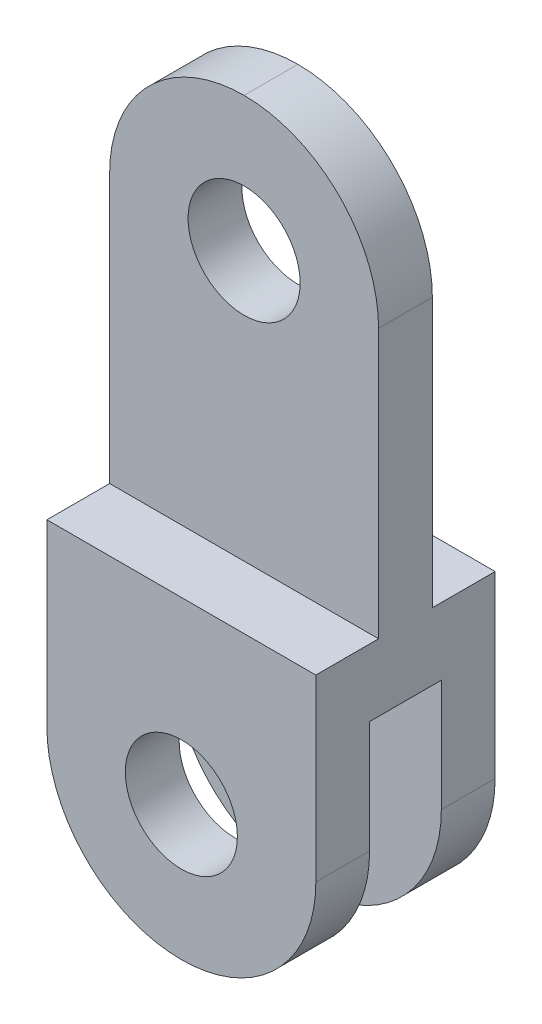
ISO-10303-21;
HEADER;
FILE_DESCRIPTION(('STEP AP214'),'2;1');
FILE_NAME('part.step','',(''),(''),'','','');
FILE_SCHEMA(('AUTOMOTIVE_DESIGN { 1 0 10303 214 1 1 1 1 }'));
ENDSEC;
DATA;
#1=APPLICATION_CONTEXT('core data for automotive mechanical design processes');
#2=APPLICATION_PROTOCOL_DEFINITION('international standard','automotive_design',2000,#1);
#3=PRODUCT_CONTEXT('',#1,'mechanical');
#4=PRODUCT('Part','Part','',(#3));
#5=PRODUCT_RELATED_PRODUCT_CATEGORY('part','',(#4));
#6=PRODUCT_DEFINITION_FORMATION('','',#4);
#7=PRODUCT_DEFINITION_CONTEXT('part definition',#1,'design');
#8=PRODUCT_DEFINITION('design','',#6,#7);
#9=PRODUCT_DEFINITION_SHAPE('','',#8);
#10=(LENGTH_UNIT() NAMED_UNIT(*) SI_UNIT(.MILLI.,.METRE.));
#11=(NAMED_UNIT(*) PLANE_ANGLE_UNIT() SI_UNIT($,.RADIAN.));
#12=(NAMED_UNIT(*) SI_UNIT($,.STERADIAN.) SOLID_ANGLE_UNIT());
#13=UNCERTAINTY_MEASURE_WITH_UNIT(LENGTH_MEASURE(1.E-05),#10,'distance_accuracy_value','');
#14=(GEOMETRIC_REPRESENTATION_CONTEXT(3) GLOBAL_UNCERTAINTY_ASSIGNED_CONTEXT((#13)) GLOBAL_UNIT_ASSIGNED_CONTEXT((#10,
#11,#12)) REPRESENTATION_CONTEXT('',''));
#15=CARTESIAN_POINT('',(0.,0.,0.));
#16=DIRECTION('',(0.,0.,1.));
#17=DIRECTION('',(1.,0.,0.));
#18=AXIS2_PLACEMENT_3D('',#15,#16,#17);
#19=CARTESIAN_POINT('',(30.,-55.,-20.));
#20=DIRECTION('',(0.,0.,1.));
#21=DIRECTION('',(0.,-1.,0.));
#22=AXIS2_PLACEMENT_3D('',#19,#20,#21);
#23=PLANE('',#22);
#24=CARTESIAN_POINT('',(0.,-25.,-20.));
#25=DIRECTION('',(0.,0.,1.));
#26=DIRECTION('',(1.,0.,0.));
#27=AXIS2_PLACEMENT_3D('',#24,#25,#26);
#28=CIRCLE('',#27,12.5);
#29=CARTESIAN_POINT('',(12.5,-25.,-20.));
#30=VERTEX_POINT('',#29);
#31=EDGE_CURVE('E222',#30,#30,#28,.T.);
#32=ORIENTED_EDGE('',*,*,#31,.T.);
#33=EDGE_LOOP('',(#32));
#34=FACE_BOUND('',#33,.T.);
#35=DIRECTION('',(0.,1.,0.));
#36=VECTOR('',#35,1.);
#37=CARTESIAN_POINT('',(30.,-55.,-20.));
#38=LINE('',#37,#36);
#39=CARTESIAN_POINT('',(30.,-25.,-20.));
#40=VERTEX_POINT('',#39);
#41=CARTESIAN_POINT('',(30.,15.,-20.));
#42=VERTEX_POINT('',#41);
#43=EDGE_CURVE('E147',#40,#42,#38,.T.);
#44=ORIENTED_EDGE('',*,*,#43,.F.);
#45=CARTESIAN_POINT('',(0.,-25.,-20.));
#46=DIRECTION('',(0.,0.,1.));
#47=DIRECTION('',(0.,-1.,0.));
#48=AXIS2_PLACEMENT_3D('',#45,#46,#47);
#49=CIRCLE('',#48,30.);
#50=CARTESIAN_POINT('',(0.,-55.,-20.));
#51=VERTEX_POINT('',#50);
#52=EDGE_CURVE('E200',#40,#51,#49,.F.);
#53=ORIENTED_EDGE('',*,*,#52,.T.);
#54=CARTESIAN_POINT('',(0.,-25.,-20.));
#55=DIRECTION('',(0.,0.,1.));
#56=DIRECTION('',(0.,-1.,0.));
#57=AXIS2_PLACEMENT_3D('',#54,#55,#56);
#58=CIRCLE('',#57,30.);
#59=CARTESIAN_POINT('',(-30.,-25.,-20.));
#60=VERTEX_POINT('',#59);
#61=EDGE_CURVE('E198',#51,#60,#58,.F.);
#62=ORIENTED_EDGE('',*,*,#61,.T.);
#63=DIRECTION('',(0.,1.,0.));
#64=VECTOR('',#63,1.);
#65=CARTESIAN_POINT('',(-30.,-55.,-20.));
#66=LINE('',#65,#64);
#67=CARTESIAN_POINT('',(-30.,15.,-20.));
#68=VERTEX_POINT('',#67);
#69=EDGE_CURVE('E170',#60,#68,#66,.T.);
#70=ORIENTED_EDGE('',*,*,#69,.T.);
#71=DIRECTION('',(-1.,0.,0.));
#72=VECTOR('',#71,1.);
#73=CARTESIAN_POINT('',(30.,15.,-20.));
#74=LINE('',#73,#72);
#75=EDGE_CURVE('E163',#42,#68,#74,.T.);
#76=ORIENTED_EDGE('',*,*,#75,.F.);
#77=EDGE_LOOP('',(#44,#53,#62,#70,#76));
#78=FACE_BOUND('',#77,.T.);
#79=ADVANCED_FACE('F39',(#34,#78),#23,.F.);
#80=CARTESIAN_POINT('',(30.,15.,-20.));
#81=DIRECTION('',(0.,-1.,0.));
#82=DIRECTION('',(0.,0.,-1.));
#83=AXIS2_PLACEMENT_3D('',#80,#81,#82);
#84=PLANE('',#83);
#85=DIRECTION('',(0.,0.,1.));
#86=VECTOR('',#85,1.);
#87=CARTESIAN_POINT('',(-30.,15.,-20.));
#88=LINE('',#87,#86);
#89=CARTESIAN_POINT('',(-30.,15.,-6.));
#90=VERTEX_POINT('',#89);
#91=EDGE_CURVE('E253',#68,#90,#88,.T.);
#92=ORIENTED_EDGE('',*,*,#91,.T.);
#93=DIRECTION('',(-1.,0.,0.));
#94=VECTOR('',#93,1.);
#95=CARTESIAN_POINT('',(30.,15.,-6.));
#96=LINE('',#95,#94);
#97=CARTESIAN_POINT('',(30.,15.,-6.));
#98=VERTEX_POINT('',#97);
#99=EDGE_CURVE('E165',#98,#90,#96,.T.);
#100=ORIENTED_EDGE('',*,*,#99,.F.);
#101=DIRECTION('',(0.,0.,1.));
#102=VECTOR('',#101,1.);
#103=CARTESIAN_POINT('',(30.,15.,-20.));
#104=LINE('',#103,#102);
#105=EDGE_CURVE('E151',#42,#98,#104,.T.);
#106=ORIENTED_EDGE('',*,*,#105,.F.);
#107=ORIENTED_EDGE('',*,*,#75,.T.);
#108=EDGE_LOOP('',(#92,#100,#106,#107));
#109=FACE_BOUND('',#108,.T.);
#110=ADVANCED_FACE('F162',(#109),#84,.F.);
#111=CARTESIAN_POINT('',(30.,15.,-6.));
#112=DIRECTION('',(0.,0.,1.));
#113=DIRECTION('',(1.,0.,0.));
#114=AXIS2_PLACEMENT_3D('',#111,#112,#113);
#115=PLANE('',#114);
#116=CARTESIAN_POINT('',(0.,75.,-6.));
#117=DIRECTION('',(0.,0.,1.));
#118=DIRECTION('',(1.,0.,0.));
#119=AXIS2_PLACEMENT_3D('',#116,#117,#118);
#120=CIRCLE('',#119,12.5);
#121=CARTESIAN_POINT('',(12.5,75.,-6.));
#122=VERTEX_POINT('',#121);
#123=EDGE_CURVE('E218',#122,#122,#120,.T.);
#124=ORIENTED_EDGE('',*,*,#123,.T.);
#125=EDGE_LOOP('',(#124));
#126=FACE_BOUND('',#125,.T.);
#127=DIRECTION('',(0.,1.,0.));
#128=VECTOR('',#127,1.);
#129=CARTESIAN_POINT('',(-30.,15.,-6.));
#130=LINE('',#129,#128);
#131=CARTESIAN_POINT('',(-30.,75.,-6.));
#132=VERTEX_POINT('',#131);
#133=EDGE_CURVE('E255',#90,#132,#130,.T.);
#134=ORIENTED_EDGE('',*,*,#133,.T.);
#135=CARTESIAN_POINT('',(0.,75.,-6.));
#136=DIRECTION('',(0.,0.,1.));
#137=DIRECTION('',(1.,0.,0.));
#138=AXIS2_PLACEMENT_3D('',#135,#136,#137);
#139=CIRCLE('',#138,30.);
#140=CARTESIAN_POINT('',(0.,105.,-6.));
#141=VERTEX_POINT('',#140);
#142=EDGE_CURVE('E191',#132,#141,#139,.F.);
#143=ORIENTED_EDGE('',*,*,#142,.T.);
#144=CARTESIAN_POINT('',(0.,75.,-6.));
#145=DIRECTION('',(0.,0.,1.));
#146=DIRECTION('',(1.,0.,0.));
#147=AXIS2_PLACEMENT_3D('',#144,#145,#146);
#148=CIRCLE('',#147,30.);
#149=CARTESIAN_POINT('',(30.,75.,-6.));
#150=VERTEX_POINT('',#149);
#151=EDGE_CURVE('E189',#141,#150,#148,.F.);
#152=ORIENTED_EDGE('',*,*,#151,.T.);
#153=DIRECTION('',(0.,1.,0.));
#154=VECTOR('',#153,1.);
#155=CARTESIAN_POINT('',(30.,15.,-6.));
#156=LINE('',#155,#154);
#157=EDGE_CURVE('E167',#98,#150,#156,.T.);
#158=ORIENTED_EDGE('',*,*,#157,.F.);
#159=ORIENTED_EDGE('',*,*,#99,.T.);
#160=EDGE_LOOP('',(#134,#143,#152,#158,#159));
#161=FACE_BOUND('',#160,.T.);
#162=ADVANCED_FACE('F322',(#126,#161),#115,.F.);
#163=CARTESIAN_POINT('',(30.,15.,6.));
#164=DIRECTION('',(0.,0.,-1.));
#165=DIRECTION('',(-1.,0.,0.));
#166=AXIS2_PLACEMENT_3D('',#163,#164,#165);
#167=PLANE('',#166);
#168=CARTESIAN_POINT('',(0.,75.,6.));
#169=DIRECTION('',(0.,0.,-1.));
#170=DIRECTION('',(-1.,0.,0.));
#171=AXIS2_PLACEMENT_3D('',#168,#169,#170);
#172=CIRCLE('',#171,12.5);
#173=CARTESIAN_POINT('',(12.5,75.,6.));
#174=VERTEX_POINT('',#173);
#175=EDGE_CURVE('E43',#174,#174,#172,.T.);
#176=ORIENTED_EDGE('',*,*,#175,.T.);
#177=EDGE_LOOP('',(#176));
#178=FACE_BOUND('',#177,.T.);
#179=CARTESIAN_POINT('',(0.,75.,6.));
#180=DIRECTION('',(0.,0.,-1.));
#181=DIRECTION('',(-1.,0.,0.));
#182=AXIS2_PLACEMENT_3D('',#179,#180,#181);
#183=CIRCLE('',#182,30.);
#184=CARTESIAN_POINT('',(30.,75.,6.));
#185=VERTEX_POINT('',#184);
#186=CARTESIAN_POINT('',(0.,105.,6.));
#187=VERTEX_POINT('',#186);
#188=EDGE_CURVE('E172',#185,#187,#183,.F.);
#189=ORIENTED_EDGE('',*,*,#188,.T.);
#190=CARTESIAN_POINT('',(0.,75.,6.));
#191=DIRECTION('',(0.,0.,-1.));
#192=DIRECTION('',(-1.,0.,0.));
#193=AXIS2_PLACEMENT_3D('',#190,#191,#192);
#194=CIRCLE('',#193,30.);
#195=CARTESIAN_POINT('',(-30.,75.,6.));
#196=VERTEX_POINT('',#195);
#197=EDGE_CURVE('E174',#187,#196,#194,.F.);
#198=ORIENTED_EDGE('',*,*,#197,.T.);
#199=DIRECTION('',(0.,-1.,0.));
#200=VECTOR('',#199,1.);
#201=CARTESIAN_POINT('',(-30.,15.,6.));
#202=LINE('',#201,#200);
#203=CARTESIAN_POINT('',(-30.,15.,6.));
#204=VERTEX_POINT('',#203);
#205=EDGE_CURVE('E258',#196,#204,#202,.T.);
#206=ORIENTED_EDGE('',*,*,#205,.T.);
#207=DIRECTION('',(-1.,0.,0.));
#208=VECTOR('',#207,1.);
#209=CARTESIAN_POINT('',(30.,15.,6.));
#210=LINE('',#209,#208);
#211=CARTESIAN_POINT('',(30.,15.,6.));
#212=VERTEX_POINT('',#211);
#213=EDGE_CURVE('E176',#212,#204,#210,.T.);
#214=ORIENTED_EDGE('',*,*,#213,.F.);
#215=DIRECTION('',(0.,-1.,0.));
#216=VECTOR('',#215,1.);
#217=CARTESIAN_POINT('',(30.,15.,6.));
#218=LINE('',#217,#216);
#219=EDGE_CURVE('E238',#185,#212,#218,.T.);
#220=ORIENTED_EDGE('',*,*,#219,.F.);
#221=EDGE_LOOP('',(#189,#198,#206,#214,#220));
#222=FACE_BOUND('',#221,.T.);
#223=ADVANCED_FACE('F330',(#178,#222),#167,.F.);
#224=CARTESIAN_POINT('',(30.,15.,20.));
#225=DIRECTION('',(0.,-1.,0.));
#226=DIRECTION('',(0.,0.,-1.));
#227=AXIS2_PLACEMENT_3D('',#224,#225,#226);
#228=PLANE('',#227);
#229=DIRECTION('',(0.,0.,1.));
#230=VECTOR('',#229,1.);
#231=CARTESIAN_POINT('',(-30.,15.,20.));
#232=LINE('',#231,#230);
#233=CARTESIAN_POINT('',(-30.,15.,20.));
#234=VERTEX_POINT('',#233);
#235=EDGE_CURVE('E260',#204,#234,#232,.T.);
#236=ORIENTED_EDGE('',*,*,#235,.T.);
#237=DIRECTION('',(-1.,0.,0.));
#238=VECTOR('',#237,1.);
#239=CARTESIAN_POINT('',(30.,15.,20.));
#240=LINE('',#239,#238);
#241=CARTESIAN_POINT('',(30.,15.,20.));
#242=VERTEX_POINT('',#241);
#243=EDGE_CURVE('E275',#242,#234,#240,.T.);
#244=ORIENTED_EDGE('',*,*,#243,.F.);
#245=DIRECTION('',(0.,0.,1.));
#246=VECTOR('',#245,1.);
#247=CARTESIAN_POINT('',(30.,15.,20.));
#248=LINE('',#247,#246);
#249=EDGE_CURVE('E240',#212,#242,#248,.T.);
#250=ORIENTED_EDGE('',*,*,#249,.F.);
#251=ORIENTED_EDGE('',*,*,#213,.T.);
#252=EDGE_LOOP('',(#236,#244,#250,#251));
#253=FACE_BOUND('',#252,.T.);
#254=ADVANCED_FACE('F282',(#253),#228,.F.);
#255=CARTESIAN_POINT('',(30.,-55.,20.));
#256=DIRECTION('',(0.,0.,-1.));
#257=DIRECTION('',(0.,1.,0.));
#258=AXIS2_PLACEMENT_3D('',#255,#256,#257);
#259=PLANE('',#258);
#260=CARTESIAN_POINT('',(0.,-25.,20.));
#261=DIRECTION('',(0.,0.,-1.));
#262=DIRECTION('',(0.,1.,0.));
#263=AXIS2_PLACEMENT_3D('',#260,#261,#262);
#264=CIRCLE('',#263,12.5);
#265=CARTESIAN_POINT('',(0.,-12.5,20.));
#266=VERTEX_POINT('',#265);
#267=EDGE_CURVE('E226',#266,#266,#264,.T.);
#268=ORIENTED_EDGE('',*,*,#267,.T.);
#269=EDGE_LOOP('',(#268));
#270=FACE_BOUND('',#269,.T.);
#271=DIRECTION('',(0.,-1.,0.));
#272=VECTOR('',#271,1.);
#273=CARTESIAN_POINT('',(-30.,-55.,20.));
#274=LINE('',#273,#272);
#275=CARTESIAN_POINT('',(-30.,-25.,20.));
#276=VERTEX_POINT('',#275);
#277=EDGE_CURVE('E262',#234,#276,#274,.T.);
#278=ORIENTED_EDGE('',*,*,#277,.T.);
#279=CARTESIAN_POINT('',(0.,-25.,20.));
#280=DIRECTION('',(0.,0.,-1.));
#281=DIRECTION('',(0.,1.,0.));
#282=AXIS2_PLACEMENT_3D('',#279,#280,#281);
#283=CIRCLE('',#282,30.);
#284=CARTESIAN_POINT('',(0.,-55.,20.));
#285=VERTEX_POINT('',#284);
#286=EDGE_CURVE('E11',#276,#285,#283,.F.);
#287=ORIENTED_EDGE('',*,*,#286,.T.);
#288=CARTESIAN_POINT('',(0.,-25.,20.));
#289=DIRECTION('',(0.,0.,-1.));
#290=DIRECTION('',(0.,1.,0.));
#291=AXIS2_PLACEMENT_3D('',#288,#289,#290);
#292=CIRCLE('',#291,30.);
#293=CARTESIAN_POINT('',(30.,-25.,20.));
#294=VERTEX_POINT('',#293);
#295=EDGE_CURVE('E48',#285,#294,#292,.F.);
#296=ORIENTED_EDGE('',*,*,#295,.T.);
#297=DIRECTION('',(0.,-1.,0.));
#298=VECTOR('',#297,1.);
#299=CARTESIAN_POINT('',(30.,-55.,20.));
#300=LINE('',#299,#298);
#301=EDGE_CURVE('E242',#242,#294,#300,.T.);
#302=ORIENTED_EDGE('',*,*,#301,.F.);
#303=ORIENTED_EDGE('',*,*,#243,.T.);
#304=EDGE_LOOP('',(#278,#287,#296,#302,#303));
#305=FACE_BOUND('',#304,.T.);
#306=ADVANCED_FACE('F293',(#270,#305),#259,.F.);
#307=CARTESIAN_POINT('',(30.,0.,7.99999999999999));
#308=DIRECTION('',(0.,0.,1.));
#309=DIRECTION('',(0.,-1.,0.));
#310=AXIS2_PLACEMENT_3D('',#307,#308,#309);
#311=PLANE('',#310);
#312=CARTESIAN_POINT('',(0.,-25.,7.99999999999999));
#313=DIRECTION('',(0.,0.,1.));
#314=DIRECTION('',(0.,-1.,0.));
#315=AXIS2_PLACEMENT_3D('',#312,#313,#314);
#316=CIRCLE('',#315,12.5);
#317=CARTESIAN_POINT('',(0.,-37.5,7.99999999999999));
#318=VERTEX_POINT('',#317);
#319=EDGE_CURVE('E221',#318,#318,#316,.T.);
#320=ORIENTED_EDGE('',*,*,#319,.T.);
#321=EDGE_LOOP('',(#320));
#322=FACE_BOUND('',#321,.T.);
#323=CARTESIAN_POINT('',(0.,-25.,7.99999999999999));
#324=DIRECTION('',(0.,0.,1.));
#325=DIRECTION('',(0.,-1.,0.));
#326=AXIS2_PLACEMENT_3D('',#323,#324,#325);
#327=CIRCLE('',#326,30.);
#328=CARTESIAN_POINT('',(30.,-25.,7.99999999999999));
#329=VERTEX_POINT('',#328);
#330=CARTESIAN_POINT('',(0.,-55.,7.99999999999999));
#331=VERTEX_POINT('',#330);
#332=EDGE_CURVE('E62',#329,#331,#327,.F.);
#333=ORIENTED_EDGE('',*,*,#332,.T.);
#334=CARTESIAN_POINT('',(0.,-25.,7.99999999999999));
#335=DIRECTION('',(0.,0.,1.));
#336=DIRECTION('',(0.,-1.,0.));
#337=AXIS2_PLACEMENT_3D('',#334,#335,#336);
#338=CIRCLE('',#337,30.);
#339=CARTESIAN_POINT('',(-30.,-25.,7.99999999999999));
#340=VERTEX_POINT('',#339);
#341=EDGE_CURVE('E207',#331,#340,#338,.F.);
#342=ORIENTED_EDGE('',*,*,#341,.T.);
#343=DIRECTION('',(0.,1.,0.));
#344=VECTOR('',#343,1.);
#345=CARTESIAN_POINT('',(-30.,0.,7.99999999999999));
#346=LINE('',#345,#344);
#347=CARTESIAN_POINT('',(-30.,0.,7.99999999999999));
#348=VERTEX_POINT('',#347);
#349=EDGE_CURVE('E264',#340,#348,#346,.T.);
#350=ORIENTED_EDGE('',*,*,#349,.T.);
#351=DIRECTION('',(-1.,0.,0.));
#352=VECTOR('',#351,1.);
#353=CARTESIAN_POINT('',(30.,0.,7.99999999999999));
#354=LINE('',#353,#352);
#355=CARTESIAN_POINT('',(30.,0.,7.99999999999999));
#356=VERTEX_POINT('',#355);
#357=EDGE_CURVE('E272',#356,#348,#354,.T.);
#358=ORIENTED_EDGE('',*,*,#357,.F.);
#359=DIRECTION('',(0.,1.,0.));
#360=VECTOR('',#359,1.);
#361=CARTESIAN_POINT('',(30.,0.,7.99999999999999));
#362=LINE('',#361,#360);
#363=EDGE_CURVE('E245',#329,#356,#362,.T.);
#364=ORIENTED_EDGE('',*,*,#363,.F.);
#365=EDGE_LOOP('',(#333,#342,#350,#358,#364));
#366=FACE_BOUND('',#365,.T.);
#367=ADVANCED_FACE('F300',(#322,#366),#311,.F.);
#368=CARTESIAN_POINT('',(30.,0.,-7.99999999999999));
#369=DIRECTION('',(0.,1.,0.));
#370=DIRECTION('',(0.,0.,1.));
#371=AXIS2_PLACEMENT_3D('',#368,#369,#370);
#372=PLANE('',#371);
#373=DIRECTION('',(0.,0.,-1.));
#374=VECTOR('',#373,1.);
#375=CARTESIAN_POINT('',(-30.,0.,-7.99999999999999));
#376=LINE('',#375,#374);
#377=CARTESIAN_POINT('',(-30.,0.,-7.99999999999999));
#378=VERTEX_POINT('',#377);
#379=EDGE_CURVE('E266',#348,#378,#376,.T.);
#380=ORIENTED_EDGE('',*,*,#379,.T.);
#381=DIRECTION('',(-1.,0.,0.));
#382=VECTOR('',#381,1.);
#383=CARTESIAN_POINT('',(30.,0.,-7.99999999999999));
#384=LINE('',#383,#382);
#385=CARTESIAN_POINT('',(30.,0.,-7.99999999999999));
#386=VERTEX_POINT('',#385);
#387=EDGE_CURVE('E251',#386,#378,#384,.T.);
#388=ORIENTED_EDGE('',*,*,#387,.F.);
#389=DIRECTION('',(0.,0.,-1.));
#390=VECTOR('',#389,1.);
#391=CARTESIAN_POINT('',(30.,0.,-7.99999999999999));
#392=LINE('',#391,#390);
#393=EDGE_CURVE('E247',#356,#386,#392,.T.);
#394=ORIENTED_EDGE('',*,*,#393,.F.);
#395=ORIENTED_EDGE('',*,*,#357,.T.);
#396=EDGE_LOOP('',(#380,#388,#394,#395));
#397=FACE_BOUND('',#396,.T.);
#398=ADVANCED_FACE('F306',(#397),#372,.F.);
#399=CARTESIAN_POINT('',(30.,0.,-7.99999999999999));
#400=DIRECTION('',(0.,0.,-1.));
#401=DIRECTION('',(0.,1.,0.));
#402=AXIS2_PLACEMENT_3D('',#399,#400,#401);
#403=PLANE('',#402);
#404=CARTESIAN_POINT('',(0.,-25.,-7.99999999999999));
#405=DIRECTION('',(0.,0.,-1.));
#406=DIRECTION('',(0.,1.,0.));
#407=AXIS2_PLACEMENT_3D('',#404,#405,#406);
#408=CIRCLE('',#407,12.5);
#409=CARTESIAN_POINT('',(0.,-12.5,-7.99999999999999));
#410=VERTEX_POINT('',#409);
#411=EDGE_CURVE('E219',#410,#410,#408,.T.);
#412=ORIENTED_EDGE('',*,*,#411,.T.);
#413=EDGE_LOOP('',(#412));
#414=FACE_BOUND('',#413,.T.);
#415=CARTESIAN_POINT('',(0.,-25.,-7.99999999999999));
#416=DIRECTION('',(0.,0.,-1.));
#417=DIRECTION('',(0.,1.,0.));
#418=AXIS2_PLACEMENT_3D('',#415,#416,#417);
#419=CIRCLE('',#418,30.);
#420=CARTESIAN_POINT('',(-30.,-25.,-7.99999999999999));
#421=VERTEX_POINT('',#420);
#422=CARTESIAN_POINT('',(0.,-55.,-7.99999999999999));
#423=VERTEX_POINT('',#422);
#424=EDGE_CURVE('E202',#421,#423,#419,.F.);
#425=ORIENTED_EDGE('',*,*,#424,.T.);
#426=CARTESIAN_POINT('',(0.,-25.,-7.99999999999999));
#427=DIRECTION('',(0.,0.,-1.));
#428=DIRECTION('',(0.,1.,0.));
#429=AXIS2_PLACEMENT_3D('',#426,#427,#428);
#430=CIRCLE('',#429,30.);
#431=CARTESIAN_POINT('',(30.,-25.,-7.99999999999999));
#432=VERTEX_POINT('',#431);
#433=EDGE_CURVE('E204',#423,#432,#430,.F.);
#434=ORIENTED_EDGE('',*,*,#433,.T.);
#435=DIRECTION('',(0.,-1.,0.));
#436=VECTOR('',#435,1.);
#437=CARTESIAN_POINT('',(30.,0.,-7.99999999999999));
#438=LINE('',#437,#436);
#439=EDGE_CURVE('E249',#386,#432,#438,.T.);
#440=ORIENTED_EDGE('',*,*,#439,.F.);
#441=ORIENTED_EDGE('',*,*,#387,.T.);
#442=DIRECTION('',(0.,-1.,0.));
#443=VECTOR('',#442,1.);
#444=CARTESIAN_POINT('',(-30.,0.,-7.99999999999999));
#445=LINE('',#444,#443);
#446=EDGE_CURVE('E158',#378,#421,#445,.T.);
#447=ORIENTED_EDGE('',*,*,#446,.T.);
#448=EDGE_LOOP('',(#425,#434,#440,#441,#447));
#449=FACE_BOUND('',#448,.T.);
#450=ADVANCED_FACE('F310',(#414,#449),#403,.F.);
#451=CARTESIAN_POINT('',(30.,0.,0.));
#452=DIRECTION('',(1.,0.,0.));
#453=DIRECTION('',(0.,0.,-1.));
#454=AXIS2_PLACEMENT_3D('',#451,#452,#453);
#455=PLANE('',#454);
#456=ORIENTED_EDGE('',*,*,#157,.T.);
#457=DIRECTION('',(0.,0.,1.));
#458=VECTOR('',#457,1.);
#459=CARTESIAN_POINT('',(30.,75.,6.));
#460=LINE('',#459,#458);
#461=EDGE_CURVE('E196',#150,#185,#460,.T.);
#462=ORIENTED_EDGE('',*,*,#461,.T.);
#463=ORIENTED_EDGE('',*,*,#219,.T.);
#464=ORIENTED_EDGE('',*,*,#249,.T.);
#465=ORIENTED_EDGE('',*,*,#301,.T.);
#466=DIRECTION('',(0.,0.,-1.));
#467=VECTOR('',#466,1.);
#468=CARTESIAN_POINT('',(30.,-25.,7.99999999999999));
#469=LINE('',#468,#467);
#470=EDGE_CURVE('E193',#294,#329,#469,.T.);
#471=ORIENTED_EDGE('',*,*,#470,.T.);
#472=ORIENTED_EDGE('',*,*,#363,.T.);
#473=ORIENTED_EDGE('',*,*,#393,.T.);
#474=ORIENTED_EDGE('',*,*,#439,.T.);
#475=DIRECTION('',(0.,0.,-1.));
#476=VECTOR('',#475,1.);
#477=CARTESIAN_POINT('',(30.,-25.,-20.));
#478=LINE('',#477,#476);
#479=EDGE_CURVE('E155',#432,#40,#478,.T.);
#480=ORIENTED_EDGE('',*,*,#479,.T.);
#481=ORIENTED_EDGE('',*,*,#43,.T.);
#482=ORIENTED_EDGE('',*,*,#105,.T.);
#483=EDGE_LOOP('',(#456,#462,#463,#464,#465,#471,#472,#473,#474,#480,#481,#482));
#484=FACE_BOUND('',#483,.T.);
#485=ADVANCED_FACE('F150',(#484),#455,.T.);
#486=CARTESIAN_POINT('',(-30.,0.,0.));
#487=DIRECTION('',(1.,0.,0.));
#488=DIRECTION('',(0.,0.,-1.));
#489=AXIS2_PLACEMENT_3D('',#486,#487,#488);
#490=PLANE('',#489);
#491=ORIENTED_EDGE('',*,*,#205,.F.);
#492=DIRECTION('',(0.,0.,1.));
#493=VECTOR('',#492,1.);
#494=CARTESIAN_POINT('',(-30.,75.,0.));
#495=LINE('',#494,#493);
#496=EDGE_CURVE('E186',#196,#132,#495,.F.);
#497=ORIENTED_EDGE('',*,*,#496,.T.);
#498=ORIENTED_EDGE('',*,*,#133,.F.);
#499=ORIENTED_EDGE('',*,*,#91,.F.);
#500=ORIENTED_EDGE('',*,*,#69,.F.);
#501=DIRECTION('',(0.,0.,-1.));
#502=VECTOR('',#501,1.);
#503=CARTESIAN_POINT('',(-30.,-25.,0.));
#504=LINE('',#503,#502);
#505=EDGE_CURVE('E184',#60,#421,#504,.F.);
#506=ORIENTED_EDGE('',*,*,#505,.T.);
#507=ORIENTED_EDGE('',*,*,#446,.F.);
#508=ORIENTED_EDGE('',*,*,#379,.F.);
#509=ORIENTED_EDGE('',*,*,#349,.F.);
#510=DIRECTION('',(0.,0.,-1.));
#511=VECTOR('',#510,1.);
#512=CARTESIAN_POINT('',(-30.,-25.,0.));
#513=LINE('',#512,#511);
#514=EDGE_CURVE('E181',#340,#276,#513,.F.);
#515=ORIENTED_EDGE('',*,*,#514,.T.);
#516=ORIENTED_EDGE('',*,*,#277,.F.);
#517=ORIENTED_EDGE('',*,*,#235,.F.);
#518=EDGE_LOOP('',(#491,#497,#498,#499,#500,#506,#507,#508,#509,#515,#516,#517));
#519=FACE_BOUND('',#518,.T.);
#520=ADVANCED_FACE('F289',(#519),#490,.F.);
#521=CARTESIAN_POINT('',(0.,75.,0.));
#522=DIRECTION('',(0.,0.,-1.));
#523=DIRECTION('',(-1.,0.,0.));
#524=AXIS2_PLACEMENT_3D('',#521,#522,#523);
#525=CYLINDRICAL_SURFACE('',#524,30.);
#526=ORIENTED_EDGE('',*,*,#461,.F.);
#527=ORIENTED_EDGE('',*,*,#151,.F.);
#528=DIRECTION('',(0.,0.,1.));
#529=VECTOR('',#528,1.);
#530=CARTESIAN_POINT('',(0.,105.,-6.));
#531=LINE('',#530,#529);
#532=EDGE_CURVE('E210',#187,#141,#531,.F.);
#533=ORIENTED_EDGE('',*,*,#532,.F.);
#534=ORIENTED_EDGE('',*,*,#188,.F.);
#535=EDGE_LOOP('',(#526,#527,#533,#534));
#536=FACE_BOUND('',#535,.T.);
#537=ADVANCED_FACE('F327',(#536),#525,.T.);
#538=CARTESIAN_POINT('',(0.,75.,6.));
#539=DIRECTION('',(0.,0.,1.));
#540=DIRECTION('',(1.,0.,0.));
#541=AXIS2_PLACEMENT_3D('',#538,#539,#540);
#542=CYLINDRICAL_SURFACE('',#541,30.);
#543=ORIENTED_EDGE('',*,*,#142,.F.);
#544=ORIENTED_EDGE('',*,*,#496,.F.);
#545=ORIENTED_EDGE('',*,*,#197,.F.);
#546=ORIENTED_EDGE('',*,*,#532,.T.);
#547=EDGE_LOOP('',(#543,#544,#545,#546));
#548=FACE_BOUND('',#547,.T.);
#549=ADVANCED_FACE('F332',(#548),#542,.T.);
#550=CARTESIAN_POINT('',(0.,-25.,-7.99999999999999));
#551=DIRECTION('',(0.,0.,-1.));
#552=DIRECTION('',(-1.,0.,0.));
#553=AXIS2_PLACEMENT_3D('',#550,#551,#552);
#554=CYLINDRICAL_SURFACE('',#553,30.);
#555=DIRECTION('',(0.,0.,-1.));
#556=VECTOR('',#555,1.);
#557=CARTESIAN_POINT('',(0.,-55.,-7.99999999999999));
#558=LINE('',#557,#556);
#559=EDGE_CURVE('E213',#423,#51,#558,.T.);
#560=ORIENTED_EDGE('',*,*,#559,.F.);
#561=ORIENTED_EDGE('',*,*,#424,.F.);
#562=ORIENTED_EDGE('',*,*,#505,.F.);
#563=ORIENTED_EDGE('',*,*,#61,.F.);
#564=EDGE_LOOP('',(#560,#561,#562,#563));
#565=FACE_BOUND('',#564,.T.);
#566=ADVANCED_FACE('F319',(#565),#554,.T.);
#567=CARTESIAN_POINT('',(0.,-25.,0.));
#568=DIRECTION('',(0.,0.,1.));
#569=DIRECTION('',(1.,0.,0.));
#570=AXIS2_PLACEMENT_3D('',#567,#568,#569);
#571=CYLINDRICAL_SURFACE('',#570,30.);
#572=ORIENTED_EDGE('',*,*,#433,.F.);
#573=ORIENTED_EDGE('',*,*,#559,.T.);
#574=ORIENTED_EDGE('',*,*,#52,.F.);
#575=ORIENTED_EDGE('',*,*,#479,.F.);
#576=EDGE_LOOP('',(#572,#573,#574,#575));
#577=FACE_BOUND('',#576,.T.);
#578=ADVANCED_FACE('F314',(#577),#571,.T.);
#579=CARTESIAN_POINT('',(0.,-25.,0.));
#580=DIRECTION('',(0.,0.,1.));
#581=DIRECTION('',(1.,0.,0.));
#582=AXIS2_PLACEMENT_3D('',#579,#580,#581);
#583=CYLINDRICAL_SURFACE('',#582,30.);
#584=ORIENTED_EDGE('',*,*,#470,.F.);
#585=ORIENTED_EDGE('',*,*,#295,.F.);
#586=DIRECTION('',(0.,0.,-1.));
#587=VECTOR('',#586,1.);
#588=CARTESIAN_POINT('',(0.,-55.,20.));
#589=LINE('',#588,#587);
#590=EDGE_CURVE('E216',#331,#285,#589,.F.);
#591=ORIENTED_EDGE('',*,*,#590,.F.);
#592=ORIENTED_EDGE('',*,*,#332,.F.);
#593=EDGE_LOOP('',(#584,#585,#591,#592));
#594=FACE_BOUND('',#593,.T.);
#595=ADVANCED_FACE('F41',(#594),#583,.T.);
#596=CARTESIAN_POINT('',(0.,-25.,7.99999999999999));
#597=DIRECTION('',(0.,0.,-1.));
#598=DIRECTION('',(-1.,0.,0.));
#599=AXIS2_PLACEMENT_3D('',#596,#597,#598);
#600=CYLINDRICAL_SURFACE('',#599,30.);
#601=ORIENTED_EDGE('',*,*,#286,.F.);
#602=ORIENTED_EDGE('',*,*,#514,.F.);
#603=ORIENTED_EDGE('',*,*,#341,.F.);
#604=ORIENTED_EDGE('',*,*,#590,.T.);
#605=EDGE_LOOP('',(#601,#602,#603,#604));
#606=FACE_BOUND('',#605,.T.);
#607=ADVANCED_FACE('F299',(#606),#600,.T.);
#608=CARTESIAN_POINT('',(0.,-25.,-20.));
#609=DIRECTION('',(0.,0.,1.));
#610=DIRECTION('',(1.,0.,0.));
#611=AXIS2_PLACEMENT_3D('',#608,#609,#610);
#612=CYLINDRICAL_SURFACE('',#611,12.5);
#613=ORIENTED_EDGE('',*,*,#31,.F.);
#614=EDGE_LOOP('',(#613));
#615=FACE_BOUND('',#614,.T.);
#616=ORIENTED_EDGE('',*,*,#411,.F.);
#617=EDGE_LOOP('',(#616));
#618=FACE_BOUND('',#617,.T.);
#619=ADVANCED_FACE('F377',(#615,#618),#612,.F.);
#620=ORIENTED_EDGE('',*,*,#319,.F.);
#621=EDGE_LOOP('',(#620));
#622=FACE_BOUND('',#621,.T.);
#623=ORIENTED_EDGE('',*,*,#267,.F.);
#624=EDGE_LOOP('',(#623));
#625=FACE_BOUND('',#624,.T.);
#626=ADVANCED_FACE('F374',(#622,#625),#612,.F.);
#627=CARTESIAN_POINT('',(0.,75.,-20.));
#628=DIRECTION('',(0.,0.,1.));
#629=DIRECTION('',(1.,0.,0.));
#630=AXIS2_PLACEMENT_3D('',#627,#628,#629);
#631=CYLINDRICAL_SURFACE('',#630,12.5);
#632=CARTESIAN_POINT('',(12.5,75.,6.));
#633=CARTESIAN_POINT('',(12.5,75.,5.875));
#634=CARTESIAN_POINT('',(12.5,75.,5.75));
#635=CARTESIAN_POINT('',(12.5,75.,5.5));
#636=CARTESIAN_POINT('',(12.5,75.,5.375));
#637=CARTESIAN_POINT('',(12.5,75.,5.125));
#638=CARTESIAN_POINT('',(12.5,75.,5.));
#639=CARTESIAN_POINT('',(12.5,75.,4.75));
#640=CARTESIAN_POINT('',(12.5,75.,4.625));
#641=CARTESIAN_POINT('',(12.5,75.,4.375));
#642=CARTESIAN_POINT('',(12.5,75.,4.25));
#643=CARTESIAN_POINT('',(12.5,75.,4.));
#644=CARTESIAN_POINT('',(12.5,75.,3.875));
#645=CARTESIAN_POINT('',(12.5,75.,3.625));
#646=CARTESIAN_POINT('',(12.5,75.,3.5));
#647=CARTESIAN_POINT('',(12.5,75.,3.25));
#648=CARTESIAN_POINT('',(12.5,75.,3.125));
#649=CARTESIAN_POINT('',(12.5,75.,2.875));
#650=CARTESIAN_POINT('',(12.5,75.,2.75));
#651=CARTESIAN_POINT('',(12.5,75.,2.5));
#652=CARTESIAN_POINT('',(12.5,75.,2.375));
#653=CARTESIAN_POINT('',(12.5,75.,2.125));
#654=CARTESIAN_POINT('',(12.5,75.,2.));
#655=CARTESIAN_POINT('',(12.5,75.,1.75));
#656=CARTESIAN_POINT('',(12.5,75.,1.625));
#657=CARTESIAN_POINT('',(12.5,75.,1.375));
#658=CARTESIAN_POINT('',(12.5,75.,1.25));
#659=CARTESIAN_POINT('',(12.5,75.,0.999999999999997));
#660=CARTESIAN_POINT('',(12.5,75.,0.874999999999997));
#661=CARTESIAN_POINT('',(12.5,75.,0.624999999999998));
#662=CARTESIAN_POINT('',(12.5,75.,0.499999999999999));
#663=CARTESIAN_POINT('',(12.5,75.,0.25));
#664=CARTESIAN_POINT('',(12.5,75.,0.125));
#665=CARTESIAN_POINT('',(12.5,75.,-0.125));
#666=CARTESIAN_POINT('',(12.5,75.,-0.25));
#667=CARTESIAN_POINT('',(12.5,75.,-0.5));
#668=CARTESIAN_POINT('',(12.5,75.,-0.625000000000001));
#669=CARTESIAN_POINT('',(12.5,75.,-0.875000000000001));
#670=CARTESIAN_POINT('',(12.5,75.,-1.));
#671=CARTESIAN_POINT('',(12.5,75.,-1.25));
#672=CARTESIAN_POINT('',(12.5,75.,-1.375));
#673=CARTESIAN_POINT('',(12.5,75.,-1.625));
#674=CARTESIAN_POINT('',(12.5,75.,-1.75));
#675=CARTESIAN_POINT('',(12.5,75.,-2.));
#676=CARTESIAN_POINT('',(12.5,75.,-2.125));
#677=CARTESIAN_POINT('',(12.5,75.,-2.375));
#678=CARTESIAN_POINT('',(12.5,75.,-2.5));
#679=CARTESIAN_POINT('',(12.5,75.,-2.75));
#680=CARTESIAN_POINT('',(12.5,75.,-2.875));
#681=CARTESIAN_POINT('',(12.5,75.,-3.125));
#682=CARTESIAN_POINT('',(12.5,75.,-3.25));
#683=CARTESIAN_POINT('',(12.5,75.,-3.5));
#684=CARTESIAN_POINT('',(12.5,75.,-3.625));
#685=CARTESIAN_POINT('',(12.5,75.,-3.875));
#686=CARTESIAN_POINT('',(12.5,75.,-4.));
#687=CARTESIAN_POINT('',(12.5,75.,-4.25));
#688=CARTESIAN_POINT('',(12.5,75.,-4.375));
#689=CARTESIAN_POINT('',(12.5,75.,-4.625));
#690=CARTESIAN_POINT('',(12.5,75.,-4.75));
#691=CARTESIAN_POINT('',(12.5,75.,-5.));
#692=CARTESIAN_POINT('',(12.5,75.,-5.125));
#693=CARTESIAN_POINT('',(12.5,75.,-5.375));
#694=CARTESIAN_POINT('',(12.5,75.,-5.5));
#695=CARTESIAN_POINT('',(12.5,75.,-5.75));
#696=CARTESIAN_POINT('',(12.5,75.,-5.875));
#697=CARTESIAN_POINT('',(12.5,75.,-6.));
#698=B_SPLINE_CURVE_WITH_KNOTS('',3,(#632,#633,#634,#635,#636,#637,#638,#639,#640,#641,#642,
#643,#644,#645,#646,#647,#648,#649,#650,#651,#652,#653,#654,#655,#656,#657,#658,#659,#660,#661,
#662,#663,#664,#665,#666,#667,#668,#669,#670,#671,#672,#673,#674,#675,#676,#677,#678,#679,#680,
#681,#682,#683,#684,#685,#686,#687,#688,#689,#690,#691,#692,#693,#694,#695,#696,#697),
.UNSPECIFIED.,.F.,.F.,(4,2,2,2,2,2,2,2,2,2,2,2,2,2,2,2,2,2,2,2,2,2,2,2,2,2,2,2,2,2,2,2,4),(0.,
0.375,0.750000000000001,1.125,1.5,1.875,2.25,2.625,3.,3.375,3.75,4.125,4.5,4.875,5.25,5.625,6.,
6.375,6.75,7.125,7.5,7.875,8.25,8.625,9.,9.375,9.75,10.125,10.5,10.875,11.25,11.625,12.),.UNSPECIFIED.);
#699=EDGE_CURVE('BSEAM371',#174,#122,#698,.T.);
#700=ORIENTED_EDGE('',*,*,#175,.F.);
#701=ORIENTED_EDGE('',*,*,#123,.F.);
#702=ORIENTED_EDGE('',*,*,#699,.T.);
#703=ORIENTED_EDGE('',*,*,#699,.F.);
#704=EDGE_LOOP('',(#700,#702,#701,#703));
#705=FACE_BOUND('',#704,.T.);
#706=ADVANCED_FACE('F371',(#705),#631,.F.);
#707=CLOSED_SHELL('',(#79,#110,#162,#223,#254,#306,#367,#398,#450,#485,#520,#537,#549,#566,#578,
#595,#607,#619,#626,#706));
#708=MANIFOLD_SOLID_BREP('B2',#707);
#709=ADVANCED_BREP_SHAPE_REPRESENTATION('',(#18,#708),#14);
#710=SHAPE_DEFINITION_REPRESENTATION(#9,#709);
ENDSEC;
END-ISO-10303-21;
